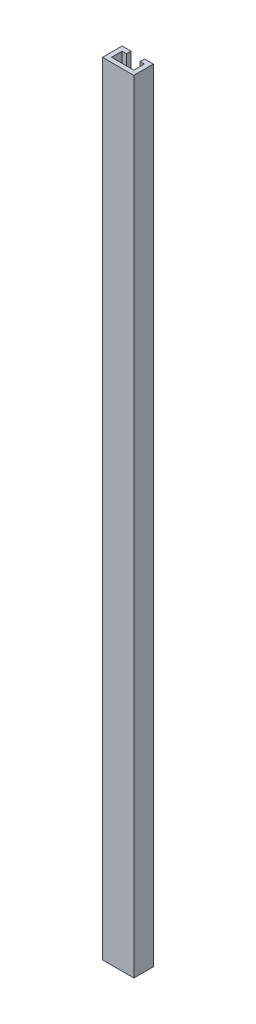
ISO-10303-21;
HEADER;
FILE_DESCRIPTION(('STEP AP214'),'2;1');
FILE_NAME('part.step','',(''),(''),'','','');
FILE_SCHEMA(('AUTOMOTIVE_DESIGN { 1 0 10303 214 1 1 1 1 }'));
ENDSEC;
DATA;
#1=APPLICATION_CONTEXT('core data for automotive mechanical design processes');
#2=APPLICATION_PROTOCOL_DEFINITION('international standard','automotive_design',2000,#1);
#3=PRODUCT_CONTEXT('',#1,'mechanical');
#4=PRODUCT('Part','Part','',(#3));
#5=PRODUCT_RELATED_PRODUCT_CATEGORY('part','',(#4));
#6=PRODUCT_DEFINITION_FORMATION('','',#4);
#7=PRODUCT_DEFINITION_CONTEXT('part definition',#1,'design');
#8=PRODUCT_DEFINITION('design','',#6,#7);
#9=PRODUCT_DEFINITION_SHAPE('','',#8);
#10=(LENGTH_UNIT() NAMED_UNIT(*) SI_UNIT(.MILLI.,.METRE.));
#11=(NAMED_UNIT(*) PLANE_ANGLE_UNIT() SI_UNIT($,.RADIAN.));
#12=(NAMED_UNIT(*) SI_UNIT($,.STERADIAN.) SOLID_ANGLE_UNIT());
#13=UNCERTAINTY_MEASURE_WITH_UNIT(LENGTH_MEASURE(1.E-05),#10,'distance_accuracy_value','');
#14=(GEOMETRIC_REPRESENTATION_CONTEXT(3) GLOBAL_UNCERTAINTY_ASSIGNED_CONTEXT((#13)) GLOBAL_UNIT_ASSIGNED_CONTEXT((#10,
#11,#12)) REPRESENTATION_CONTEXT('',''));
#15=CARTESIAN_POINT('',(0.,0.,0.));
#16=DIRECTION('',(0.,0.,1.));
#17=DIRECTION('',(1.,0.,0.));
#18=AXIS2_PLACEMENT_3D('',#15,#16,#17);
#19=CARTESIAN_POINT('',(0.,200.,0.));
#20=DIRECTION('',(1.,0.,0.));
#21=DIRECTION('',(0.,0.,-1.));
#22=AXIS2_PLACEMENT_3D('',#19,#20,#21);
#23=PLANE('',#22);
#24=DIRECTION('',(0.,0.,1.));
#25=VECTOR('',#24,1.);
#26=CARTESIAN_POINT('',(0.,0.,0.));
#27=LINE('',#26,#25);
#28=CARTESIAN_POINT('',(0.,0.,0.));
#29=VERTEX_POINT('',#28);
#30=CARTESIAN_POINT('',(0.,0.,5.));
#31=VERTEX_POINT('',#30);
#32=EDGE_CURVE('E164',#29,#31,#27,.T.);
#33=ORIENTED_EDGE('',*,*,#32,.T.);
#34=DIRECTION('',(0.,-1.,0.));
#35=VECTOR('',#34,1.);
#36=CARTESIAN_POINT('',(0.,200.,5.));
#37=LINE('',#36,#35);
#38=CARTESIAN_POINT('',(0.,200.,5.));
#39=VERTEX_POINT('',#38);
#40=EDGE_CURVE('E11',#39,#31,#37,.T.);
#41=ORIENTED_EDGE('',*,*,#40,.F.);
#42=DIRECTION('',(0.,0.,1.));
#43=VECTOR('',#42,1.);
#44=CARTESIAN_POINT('',(0.,200.,0.));
#45=LINE('',#44,#43);
#46=CARTESIAN_POINT('',(0.,200.,0.));
#47=VERTEX_POINT('',#46);
#48=EDGE_CURVE('E198',#47,#39,#45,.T.);
#49=ORIENTED_EDGE('',*,*,#48,.F.);
#50=DIRECTION('',(0.,-1.,0.));
#51=VECTOR('',#50,1.);
#52=CARTESIAN_POINT('',(0.,200.,0.));
#53=LINE('',#52,#51);
#54=EDGE_CURVE('E160',#47,#29,#53,.T.);
#55=ORIENTED_EDGE('',*,*,#54,.T.);
#56=EDGE_LOOP('',(#33,#41,#49,#55));
#57=FACE_BOUND('',#56,.T.);
#58=ADVANCED_FACE('F39',(#57),#23,.F.);
#59=CARTESIAN_POINT('',(0.,200.,5.));
#60=DIRECTION('',(0.,0.,-1.));
#61=DIRECTION('',(-1.,0.,0.));
#62=AXIS2_PLACEMENT_3D('',#59,#60,#61);
#63=PLANE('',#62);
#64=DIRECTION('',(1.,0.,0.));
#65=VECTOR('',#64,1.);
#66=CARTESIAN_POINT('',(0.,0.,5.));
#67=LINE('',#66,#65);
#68=CARTESIAN_POINT('',(8.,0.,5.));
#69=VERTEX_POINT('',#68);
#70=EDGE_CURVE('E168',#31,#69,#67,.T.);
#71=ORIENTED_EDGE('',*,*,#70,.T.);
#72=DIRECTION('',(0.,-1.,0.));
#73=VECTOR('',#72,1.);
#74=CARTESIAN_POINT('',(8.,200.,5.));
#75=LINE('',#74,#73);
#76=CARTESIAN_POINT('',(8.,200.,5.));
#77=VERTEX_POINT('',#76);
#78=EDGE_CURVE('E48',#77,#69,#75,.T.);
#79=ORIENTED_EDGE('',*,*,#78,.F.);
#80=DIRECTION('',(1.,0.,0.));
#81=VECTOR('',#80,1.);
#82=CARTESIAN_POINT('',(0.,200.,5.));
#83=LINE('',#82,#81);
#84=EDGE_CURVE('E111',#39,#77,#83,.T.);
#85=ORIENTED_EDGE('',*,*,#84,.F.);
#86=ORIENTED_EDGE('',*,*,#40,.T.);
#87=EDGE_LOOP('',(#71,#79,#85,#86));
#88=FACE_BOUND('',#87,.T.);
#89=ADVANCED_FACE('F292',(#88),#63,.F.);
#90=CARTESIAN_POINT('',(8.,200.,5.));
#91=DIRECTION('',(-1.,0.,0.));
#92=DIRECTION('',(0.,0.,1.));
#93=AXIS2_PLACEMENT_3D('',#90,#91,#92);
#94=PLANE('',#93);
#95=DIRECTION('',(0.,0.,-1.));
#96=VECTOR('',#95,1.);
#97=CARTESIAN_POINT('',(8.,0.,5.));
#98=LINE('',#97,#96);
#99=CARTESIAN_POINT('',(8.,0.,0.));
#100=VERTEX_POINT('',#99);
#101=EDGE_CURVE('E171',#69,#100,#98,.T.);
#102=ORIENTED_EDGE('',*,*,#101,.T.);
#103=DIRECTION('',(0.,-1.,0.));
#104=VECTOR('',#103,1.);
#105=CARTESIAN_POINT('',(8.,200.,0.));
#106=LINE('',#105,#104);
#107=CARTESIAN_POINT('',(8.,200.,0.));
#108=VERTEX_POINT('',#107);
#109=EDGE_CURVE('E225',#108,#100,#106,.T.);
#110=ORIENTED_EDGE('',*,*,#109,.F.);
#111=DIRECTION('',(0.,0.,-1.));
#112=VECTOR('',#111,1.);
#113=CARTESIAN_POINT('',(8.,200.,5.));
#114=LINE('',#113,#112);
#115=EDGE_CURVE('E235',#77,#108,#114,.T.);
#116=ORIENTED_EDGE('',*,*,#115,.F.);
#117=ORIENTED_EDGE('',*,*,#78,.T.);
#118=EDGE_LOOP('',(#102,#110,#116,#117));
#119=FACE_BOUND('',#118,.T.);
#120=ADVANCED_FACE('F233',(#119),#94,.F.);
#121=CARTESIAN_POINT('',(8.,200.,0.));
#122=DIRECTION('',(0.,0.,1.));
#123=DIRECTION('',(1.,0.,0.));
#124=AXIS2_PLACEMENT_3D('',#121,#122,#123);
#125=PLANE('',#124);
#126=DIRECTION('',(-1.,0.,0.));
#127=VECTOR('',#126,1.);
#128=CARTESIAN_POINT('',(8.,0.,0.));
#129=LINE('',#128,#127);
#130=CARTESIAN_POINT('',(5.75,0.,0.));
#131=VERTEX_POINT('',#130);
#132=EDGE_CURVE('E174',#100,#131,#129,.T.);
#133=ORIENTED_EDGE('',*,*,#132,.T.);
#134=DIRECTION('',(0.,-1.,0.));
#135=VECTOR('',#134,1.);
#136=CARTESIAN_POINT('',(5.75,200.,0.));
#137=LINE('',#136,#135);
#138=CARTESIAN_POINT('',(5.75,200.,0.));
#139=VERTEX_POINT('',#138);
#140=EDGE_CURVE('E221',#139,#131,#137,.T.);
#141=ORIENTED_EDGE('',*,*,#140,.F.);
#142=DIRECTION('',(-1.,0.,0.));
#143=VECTOR('',#142,1.);
#144=CARTESIAN_POINT('',(8.,200.,0.));
#145=LINE('',#144,#143);
#146=EDGE_CURVE('E254',#108,#139,#145,.T.);
#147=ORIENTED_EDGE('',*,*,#146,.F.);
#148=ORIENTED_EDGE('',*,*,#109,.T.);
#149=EDGE_LOOP('',(#133,#141,#147,#148));
#150=FACE_BOUND('',#149,.T.);
#151=ADVANCED_FACE('F244',(#150),#125,.F.);
#152=CARTESIAN_POINT('',(5.75,200.,0.));
#153=DIRECTION('',(1.,0.,0.));
#154=DIRECTION('',(0.,0.,-1.));
#155=AXIS2_PLACEMENT_3D('',#152,#153,#154);
#156=PLANE('',#155);
#157=DIRECTION('',(0.,0.,1.));
#158=VECTOR('',#157,1.);
#159=CARTESIAN_POINT('',(5.75,0.,0.));
#160=LINE('',#159,#158);
#161=CARTESIAN_POINT('',(5.75,0.,1.15));
#162=VERTEX_POINT('',#161);
#163=EDGE_CURVE('E177',#131,#162,#160,.T.);
#164=ORIENTED_EDGE('',*,*,#163,.T.);
#165=DIRECTION('',(0.,-1.,0.));
#166=VECTOR('',#165,1.);
#167=CARTESIAN_POINT('',(5.75,200.,1.15));
#168=LINE('',#167,#166);
#169=CARTESIAN_POINT('',(5.75,200.,1.15));
#170=VERTEX_POINT('',#169);
#171=EDGE_CURVE('E217',#170,#162,#168,.T.);
#172=ORIENTED_EDGE('',*,*,#171,.F.);
#173=DIRECTION('',(0.,0.,1.));
#174=VECTOR('',#173,1.);
#175=CARTESIAN_POINT('',(5.75,200.,0.));
#176=LINE('',#175,#174);
#177=EDGE_CURVE('E250',#139,#170,#176,.T.);
#178=ORIENTED_EDGE('',*,*,#177,.F.);
#179=ORIENTED_EDGE('',*,*,#140,.T.);
#180=EDGE_LOOP('',(#164,#172,#178,#179));
#181=FACE_BOUND('',#180,.T.);
#182=ADVANCED_FACE('F248',(#181),#156,.F.);
#183=CARTESIAN_POINT('',(5.75,200.,1.15));
#184=DIRECTION('',(0.,0.,-1.));
#185=DIRECTION('',(-1.,0.,0.));
#186=AXIS2_PLACEMENT_3D('',#183,#184,#185);
#187=PLANE('',#186);
#188=DIRECTION('',(1.,0.,0.));
#189=VECTOR('',#188,1.);
#190=CARTESIAN_POINT('',(5.75,0.,1.15));
#191=LINE('',#190,#189);
#192=CARTESIAN_POINT('',(6.85,0.,1.15));
#193=VERTEX_POINT('',#192);
#194=EDGE_CURVE('E180',#162,#193,#191,.T.);
#195=ORIENTED_EDGE('',*,*,#194,.T.);
#196=DIRECTION('',(0.,-1.,0.));
#197=VECTOR('',#196,1.);
#198=CARTESIAN_POINT('',(6.85,200.,1.15));
#199=LINE('',#198,#197);
#200=CARTESIAN_POINT('',(6.85,200.,1.15));
#201=VERTEX_POINT('',#200);
#202=EDGE_CURVE('E213',#201,#193,#199,.T.);
#203=ORIENTED_EDGE('',*,*,#202,.F.);
#204=DIRECTION('',(1.,0.,0.));
#205=VECTOR('',#204,1.);
#206=CARTESIAN_POINT('',(5.75,200.,1.15));
#207=LINE('',#206,#205);
#208=EDGE_CURVE('E253',#170,#201,#207,.T.);
#209=ORIENTED_EDGE('',*,*,#208,.F.);
#210=ORIENTED_EDGE('',*,*,#171,.T.);
#211=EDGE_LOOP('',(#195,#203,#209,#210));
#212=FACE_BOUND('',#211,.T.);
#213=ADVANCED_FACE('F305',(#212),#187,.F.);
#214=CARTESIAN_POINT('',(6.85,200.,1.15));
#215=DIRECTION('',(1.,0.,0.));
#216=DIRECTION('',(0.,0.,-1.));
#217=AXIS2_PLACEMENT_3D('',#214,#215,#216);
#218=PLANE('',#217);
#219=DIRECTION('',(0.,0.,1.));
#220=VECTOR('',#219,1.);
#221=CARTESIAN_POINT('',(6.85,0.,1.15));
#222=LINE('',#221,#220);
#223=CARTESIAN_POINT('',(6.85,0.,3.85));
#224=VERTEX_POINT('',#223);
#225=EDGE_CURVE('E183',#193,#224,#222,.T.);
#226=ORIENTED_EDGE('',*,*,#225,.T.);
#227=DIRECTION('',(0.,-1.,0.));
#228=VECTOR('',#227,1.);
#229=CARTESIAN_POINT('',(6.85,200.,3.85));
#230=LINE('',#229,#228);
#231=CARTESIAN_POINT('',(6.85,200.,3.85));
#232=VERTEX_POINT('',#231);
#233=EDGE_CURVE('E209',#232,#224,#230,.T.);
#234=ORIENTED_EDGE('',*,*,#233,.F.);
#235=DIRECTION('',(0.,0.,1.));
#236=VECTOR('',#235,1.);
#237=CARTESIAN_POINT('',(6.85,200.,1.15));
#238=LINE('',#237,#236);
#239=EDGE_CURVE('E258',#201,#232,#238,.T.);
#240=ORIENTED_EDGE('',*,*,#239,.F.);
#241=ORIENTED_EDGE('',*,*,#202,.T.);
#242=EDGE_LOOP('',(#226,#234,#240,#241));
#243=FACE_BOUND('',#242,.T.);
#244=ADVANCED_FACE('F308',(#243),#218,.F.);
#245=CARTESIAN_POINT('',(6.85,200.,3.85));
#246=DIRECTION('',(0.,0.,1.));
#247=DIRECTION('',(1.,0.,0.));
#248=AXIS2_PLACEMENT_3D('',#245,#246,#247);
#249=PLANE('',#248);
#250=DIRECTION('',(-1.,0.,0.));
#251=VECTOR('',#250,1.);
#252=CARTESIAN_POINT('',(6.85,0.,3.85));
#253=LINE('',#252,#251);
#254=CARTESIAN_POINT('',(1.15,0.,3.85));
#255=VERTEX_POINT('',#254);
#256=EDGE_CURVE('E186',#224,#255,#253,.T.);
#257=ORIENTED_EDGE('',*,*,#256,.T.);
#258=DIRECTION('',(0.,-1.,0.));
#259=VECTOR('',#258,1.);
#260=CARTESIAN_POINT('',(1.15,200.,3.85));
#261=LINE('',#260,#259);
#262=CARTESIAN_POINT('',(1.15,200.,3.85));
#263=VERTEX_POINT('',#262);
#264=EDGE_CURVE('E205',#263,#255,#261,.T.);
#265=ORIENTED_EDGE('',*,*,#264,.F.);
#266=DIRECTION('',(-1.,0.,0.));
#267=VECTOR('',#266,1.);
#268=CARTESIAN_POINT('',(6.85,200.,3.85));
#269=LINE('',#268,#267);
#270=EDGE_CURVE('E265',#232,#263,#269,.T.);
#271=ORIENTED_EDGE('',*,*,#270,.F.);
#272=ORIENTED_EDGE('',*,*,#233,.T.);
#273=EDGE_LOOP('',(#257,#265,#271,#272));
#274=FACE_BOUND('',#273,.T.);
#275=ADVANCED_FACE('F273',(#274),#249,.F.);
#276=CARTESIAN_POINT('',(1.15,200.,3.85));
#277=DIRECTION('',(-1.,0.,0.));
#278=DIRECTION('',(0.,0.,1.));
#279=AXIS2_PLACEMENT_3D('',#276,#277,#278);
#280=PLANE('',#279);
#281=DIRECTION('',(0.,0.,-1.));
#282=VECTOR('',#281,1.);
#283=CARTESIAN_POINT('',(1.15,0.,3.85));
#284=LINE('',#283,#282);
#285=CARTESIAN_POINT('',(1.15,0.,1.15));
#286=VERTEX_POINT('',#285);
#287=EDGE_CURVE('E189',#255,#286,#284,.T.);
#288=ORIENTED_EDGE('',*,*,#287,.T.);
#289=DIRECTION('',(0.,-1.,0.));
#290=VECTOR('',#289,1.);
#291=CARTESIAN_POINT('',(1.15,200.,1.15));
#292=LINE('',#291,#290);
#293=CARTESIAN_POINT('',(1.15,200.,1.15));
#294=VERTEX_POINT('',#293);
#295=EDGE_CURVE('E153',#294,#286,#292,.T.);
#296=ORIENTED_EDGE('',*,*,#295,.F.);
#297=DIRECTION('',(0.,0.,-1.));
#298=VECTOR('',#297,1.);
#299=CARTESIAN_POINT('',(1.15,200.,3.85));
#300=LINE('',#299,#298);
#301=EDGE_CURVE('E142',#263,#294,#300,.T.);
#302=ORIENTED_EDGE('',*,*,#301,.F.);
#303=ORIENTED_EDGE('',*,*,#264,.T.);
#304=EDGE_LOOP('',(#288,#296,#302,#303));
#305=FACE_BOUND('',#304,.T.);
#306=ADVANCED_FACE('F277',(#305),#280,.F.);
#307=CARTESIAN_POINT('',(1.15,200.,1.15));
#308=DIRECTION('',(0.,0.,-1.));
#309=DIRECTION('',(-1.,0.,0.));
#310=AXIS2_PLACEMENT_3D('',#307,#308,#309);
#311=PLANE('',#310);
#312=DIRECTION('',(1.,0.,0.));
#313=VECTOR('',#312,1.);
#314=CARTESIAN_POINT('',(1.15,0.,1.15));
#315=LINE('',#314,#313);
#316=CARTESIAN_POINT('',(2.25,0.,1.15));
#317=VERTEX_POINT('',#316);
#318=EDGE_CURVE('E151',#286,#317,#315,.T.);
#319=ORIENTED_EDGE('',*,*,#318,.T.);
#320=DIRECTION('',(0.,-1.,0.));
#321=VECTOR('',#320,1.);
#322=CARTESIAN_POINT('',(2.25,200.,1.15));
#323=LINE('',#322,#321);
#324=CARTESIAN_POINT('',(2.25,200.,1.15));
#325=VERTEX_POINT('',#324);
#326=EDGE_CURVE('E148',#325,#317,#323,.T.);
#327=ORIENTED_EDGE('',*,*,#326,.F.);
#328=DIRECTION('',(1.,0.,0.));
#329=VECTOR('',#328,1.);
#330=CARTESIAN_POINT('',(1.15,200.,1.15));
#331=LINE('',#330,#329);
#332=EDGE_CURVE('E136',#294,#325,#331,.T.);
#333=ORIENTED_EDGE('',*,*,#332,.F.);
#334=ORIENTED_EDGE('',*,*,#295,.T.);
#335=EDGE_LOOP('',(#319,#327,#333,#334));
#336=FACE_BOUND('',#335,.T.);
#337=ADVANCED_FACE('F149',(#336),#311,.F.);
#338=CARTESIAN_POINT('',(2.25,200.,1.15));
#339=DIRECTION('',(-1.,0.,0.));
#340=DIRECTION('',(0.,0.,1.));
#341=AXIS2_PLACEMENT_3D('',#338,#339,#340);
#342=PLANE('',#341);
#343=DIRECTION('',(0.,0.,-1.));
#344=VECTOR('',#343,1.);
#345=CARTESIAN_POINT('',(2.25,0.,1.15));
#346=LINE('',#345,#344);
#347=CARTESIAN_POINT('',(2.25,0.,0.));
#348=VERTEX_POINT('',#347);
#349=EDGE_CURVE('E97',#317,#348,#346,.T.);
#350=ORIENTED_EDGE('',*,*,#349,.T.);
#351=DIRECTION('',(0.,-1.,0.));
#352=VECTOR('',#351,1.);
#353=CARTESIAN_POINT('',(2.25,200.,0.));
#354=LINE('',#353,#352);
#355=CARTESIAN_POINT('',(2.25,200.,0.));
#356=VERTEX_POINT('',#355);
#357=EDGE_CURVE('E154',#356,#348,#354,.T.);
#358=ORIENTED_EDGE('',*,*,#357,.F.);
#359=DIRECTION('',(0.,0.,-1.));
#360=VECTOR('',#359,1.);
#361=CARTESIAN_POINT('',(2.25,200.,1.15));
#362=LINE('',#361,#360);
#363=EDGE_CURVE('E140',#325,#356,#362,.T.);
#364=ORIENTED_EDGE('',*,*,#363,.F.);
#365=ORIENTED_EDGE('',*,*,#326,.T.);
#366=EDGE_LOOP('',(#350,#358,#364,#365));
#367=FACE_BOUND('',#366,.T.);
#368=ADVANCED_FACE('F156',(#367),#342,.F.);
#369=CARTESIAN_POINT('',(2.25,200.,0.));
#370=DIRECTION('',(0.,0.,1.));
#371=DIRECTION('',(1.,0.,0.));
#372=AXIS2_PLACEMENT_3D('',#369,#370,#371);
#373=PLANE('',#372);
#374=DIRECTION('',(-1.,0.,0.));
#375=VECTOR('',#374,1.);
#376=CARTESIAN_POINT('',(2.25,0.,0.));
#377=LINE('',#376,#375);
#378=EDGE_CURVE('E103',#348,#29,#377,.T.);
#379=ORIENTED_EDGE('',*,*,#378,.T.);
#380=ORIENTED_EDGE('',*,*,#54,.F.);
#381=DIRECTION('',(-1.,0.,0.));
#382=VECTOR('',#381,1.);
#383=CARTESIAN_POINT('',(2.25,200.,0.));
#384=LINE('',#383,#382);
#385=EDGE_CURVE('E56',#356,#47,#384,.T.);
#386=ORIENTED_EDGE('',*,*,#385,.F.);
#387=ORIENTED_EDGE('',*,*,#357,.T.);
#388=EDGE_LOOP('',(#379,#380,#386,#387));
#389=FACE_BOUND('',#388,.T.);
#390=ADVANCED_FACE('F281',(#389),#373,.F.);
#391=CARTESIAN_POINT('',(0.,200.,0.));
#392=DIRECTION('',(0.,1.,0.));
#393=DIRECTION('',(0.,0.,1.));
#394=AXIS2_PLACEMENT_3D('',#391,#392,#393);
#395=PLANE('',#394);
#396=ORIENTED_EDGE('',*,*,#48,.T.);
#397=ORIENTED_EDGE('',*,*,#84,.T.);
#398=ORIENTED_EDGE('',*,*,#115,.T.);
#399=ORIENTED_EDGE('',*,*,#146,.T.);
#400=ORIENTED_EDGE('',*,*,#177,.T.);
#401=ORIENTED_EDGE('',*,*,#208,.T.);
#402=ORIENTED_EDGE('',*,*,#239,.T.);
#403=ORIENTED_EDGE('',*,*,#270,.T.);
#404=ORIENTED_EDGE('',*,*,#301,.T.);
#405=ORIENTED_EDGE('',*,*,#332,.T.);
#406=ORIENTED_EDGE('',*,*,#363,.T.);
#407=ORIENTED_EDGE('',*,*,#385,.T.);
#408=EDGE_LOOP('',(#396,#397,#398,#399,#400,#401,#402,#403,#404,#405,#406,#407));
#409=FACE_BOUND('',#408,.T.);
#410=ADVANCED_FACE('F138',(#409),#395,.T.);
#411=CARTESIAN_POINT('',(0.,0.,0.));
#412=DIRECTION('',(0.,1.,0.));
#413=DIRECTION('',(0.,0.,1.));
#414=AXIS2_PLACEMENT_3D('',#411,#412,#413);
#415=PLANE('',#414);
#416=ORIENTED_EDGE('',*,*,#32,.F.);
#417=ORIENTED_EDGE('',*,*,#378,.F.);
#418=ORIENTED_EDGE('',*,*,#349,.F.);
#419=ORIENTED_EDGE('',*,*,#318,.F.);
#420=ORIENTED_EDGE('',*,*,#287,.F.);
#421=ORIENTED_EDGE('',*,*,#256,.F.);
#422=ORIENTED_EDGE('',*,*,#225,.F.);
#423=ORIENTED_EDGE('',*,*,#194,.F.);
#424=ORIENTED_EDGE('',*,*,#163,.F.);
#425=ORIENTED_EDGE('',*,*,#132,.F.);
#426=ORIENTED_EDGE('',*,*,#101,.F.);
#427=ORIENTED_EDGE('',*,*,#70,.F.);
#428=EDGE_LOOP('',(#416,#417,#418,#419,#420,#421,#422,#423,#424,#425,#426,#427));
#429=FACE_BOUND('',#428,.T.);
#430=ADVANCED_FACE('F239',(#429),#415,.F.);
#431=CLOSED_SHELL('',(#58,#89,#120,#151,#182,#213,#244,#275,#306,#337,#368,#390,#410,#430));
#432=MANIFOLD_SOLID_BREP('B2',#431);
#433=ADVANCED_BREP_SHAPE_REPRESENTATION('',(#18,#432),#14);
#434=SHAPE_DEFINITION_REPRESENTATION(#9,#433);
ENDSEC;
END-ISO-10303-21;
